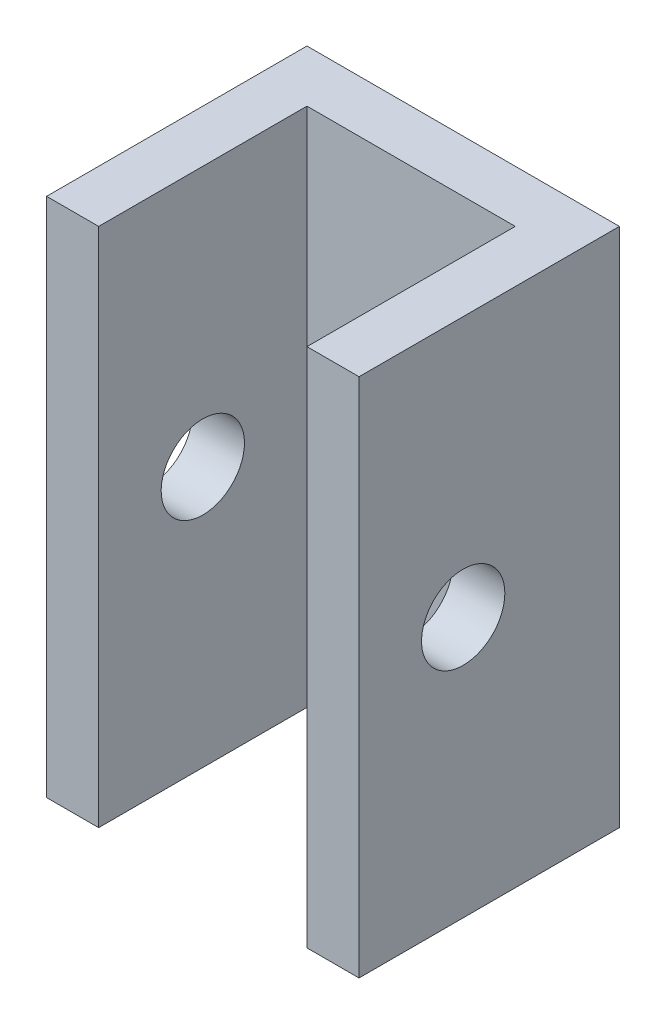
ISO-10303-21;
HEADER;
FILE_DESCRIPTION(('STEP AP214'),'2;1');
FILE_NAME('part.step','',(''),(''),'','','');
FILE_SCHEMA(('AUTOMOTIVE_DESIGN { 1 0 10303 214 1 1 1 1 }'));
ENDSEC;
DATA;
#1=APPLICATION_CONTEXT('core data for automotive mechanical design processes');
#2=APPLICATION_PROTOCOL_DEFINITION('international standard','automotive_design',2000,#1);
#3=PRODUCT_CONTEXT('',#1,'mechanical');
#4=PRODUCT('Part','Part','',(#3));
#5=PRODUCT_RELATED_PRODUCT_CATEGORY('part','',(#4));
#6=PRODUCT_DEFINITION_FORMATION('','',#4);
#7=PRODUCT_DEFINITION_CONTEXT('part definition',#1,'design');
#8=PRODUCT_DEFINITION('design','',#6,#7);
#9=PRODUCT_DEFINITION_SHAPE('','',#8);
#10=(LENGTH_UNIT() NAMED_UNIT(*) SI_UNIT(.MILLI.,.METRE.));
#11=(NAMED_UNIT(*) PLANE_ANGLE_UNIT() SI_UNIT($,.RADIAN.));
#12=(NAMED_UNIT(*) SI_UNIT($,.STERADIAN.) SOLID_ANGLE_UNIT());
#13=UNCERTAINTY_MEASURE_WITH_UNIT(LENGTH_MEASURE(1.E-05),#10,'distance_accuracy_value','');
#14=(GEOMETRIC_REPRESENTATION_CONTEXT(3) GLOBAL_UNCERTAINTY_ASSIGNED_CONTEXT((#13)) GLOBAL_UNIT_ASSIGNED_CONTEXT((#10,
#11,#12)) REPRESENTATION_CONTEXT('',''));
#15=CARTESIAN_POINT('',(0.,0.,0.));
#16=DIRECTION('',(0.,0.,1.));
#17=DIRECTION('',(1.,0.,0.));
#18=AXIS2_PLACEMENT_3D('',#15,#16,#17);
#19=CARTESIAN_POINT('',(0.,0.,5.));
#20=DIRECTION('',(0.,0.,-1.));
#21=DIRECTION('',(-1.,0.,0.));
#22=AXIS2_PLACEMENT_3D('',#19,#20,#21);
#23=PLANE('',#22);
#24=DIRECTION('',(0.,-1.,0.));
#25=VECTOR('',#24,1.);
#26=CARTESIAN_POINT('',(9.99999999999999,25.,5.));
#27=LINE('',#26,#25);
#28=CARTESIAN_POINT('',(10.,25.,5.));
#29=VERTEX_POINT('',#28);
#30=CARTESIAN_POINT('',(10.,-25.,5.));
#31=VERTEX_POINT('',#30);
#32=EDGE_CURVE('E49',#29,#31,#27,.T.);
#33=ORIENTED_EDGE('',*,*,#32,.F.);
#34=DIRECTION('',(-1.,0.,0.));
#35=VECTOR('',#34,1.);
#36=CARTESIAN_POINT('',(-15.,25.,5.));
#37=LINE('',#36,#35);
#38=CARTESIAN_POINT('',(-10.,25.,5.));
#39=VERTEX_POINT('',#38);
#40=EDGE_CURVE('E148',#29,#39,#37,.T.);
#41=ORIENTED_EDGE('',*,*,#40,.T.);
#42=DIRECTION('',(0.,1.,0.));
#43=VECTOR('',#42,1.);
#44=CARTESIAN_POINT('',(-10.,25.,5.));
#45=LINE('',#44,#43);
#46=CARTESIAN_POINT('',(-10.,-25.,5.));
#47=VERTEX_POINT('',#46);
#48=EDGE_CURVE('E129',#47,#39,#45,.T.);
#49=ORIENTED_EDGE('',*,*,#48,.F.);
#50=DIRECTION('',(1.,0.,0.));
#51=VECTOR('',#50,1.);
#52=CARTESIAN_POINT('',(-15.,-25.,5.));
#53=LINE('',#52,#51);
#54=EDGE_CURVE('E54',#47,#31,#53,.T.);
#55=ORIENTED_EDGE('',*,*,#54,.T.);
#56=EDGE_LOOP('',(#33,#41,#49,#55));
#57=FACE_BOUND('',#56,.T.);
#58=ADVANCED_FACE('F33',(#57),#23,.F.);
#59=CARTESIAN_POINT('',(15.,-25.,5.));
#60=DIRECTION('',(-1.,0.,0.));
#61=DIRECTION('',(0.,0.,1.));
#62=AXIS2_PLACEMENT_3D('',#59,#60,#61);
#63=PLANE('',#62);
#64=CARTESIAN_POINT('',(15.,-5.48172618408671E-13,15.));
#65=DIRECTION('',(1.,0.,0.));
#66=DIRECTION('',(0.,0.,-1.));
#67=AXIS2_PLACEMENT_3D('',#64,#65,#66);
#68=CIRCLE('',#67,4.);
#69=CARTESIAN_POINT('',(15.,-5.48172618408671E-13,11.));
#70=VERTEX_POINT('',#69);
#71=EDGE_CURVE('E309',#70,#70,#68,.T.);
#72=ORIENTED_EDGE('',*,*,#71,.F.);
#73=EDGE_LOOP('',(#72));
#74=FACE_BOUND('',#73,.T.);
#75=DIRECTION('',(0.,1.,0.));
#76=VECTOR('',#75,1.);
#77=CARTESIAN_POINT('',(15.,-25.,0.));
#78=LINE('',#77,#76);
#79=CARTESIAN_POINT('',(15.,-25.,0.));
#80=VERTEX_POINT('',#79);
#81=CARTESIAN_POINT('',(15.,25.,0.));
#82=VERTEX_POINT('',#81);
#83=EDGE_CURVE('E102',#80,#82,#78,.T.);
#84=ORIENTED_EDGE('',*,*,#83,.T.);
#85=DIRECTION('',(0.,0.,-1.));
#86=VECTOR('',#85,1.);
#87=CARTESIAN_POINT('',(15.,25.,5.));
#88=LINE('',#87,#86);
#89=CARTESIAN_POINT('',(15.,25.,25.));
#90=VERTEX_POINT('',#89);
#91=EDGE_CURVE('E11',#90,#82,#88,.T.);
#92=ORIENTED_EDGE('',*,*,#91,.F.);
#93=DIRECTION('',(0.,1.,0.));
#94=VECTOR('',#93,1.);
#95=CARTESIAN_POINT('',(15.,25.,25.));
#96=LINE('',#95,#94);
#97=CARTESIAN_POINT('',(15.,-25.,25.));
#98=VERTEX_POINT('',#97);
#99=EDGE_CURVE('E100',#98,#90,#96,.T.);
#100=ORIENTED_EDGE('',*,*,#99,.F.);
#101=DIRECTION('',(0.,0.,-1.));
#102=VECTOR('',#101,1.);
#103=CARTESIAN_POINT('',(15.,-25.,5.));
#104=LINE('',#103,#102);
#105=EDGE_CURVE('E152',#98,#80,#104,.T.);
#106=ORIENTED_EDGE('',*,*,#105,.T.);
#107=EDGE_LOOP('',(#84,#92,#100,#106));
#108=FACE_BOUND('',#107,.T.);
#109=ADVANCED_FACE('F35',(#74,#108),#63,.F.);
#110=CARTESIAN_POINT('',(-15.,25.,5.));
#111=DIRECTION('',(0.,-1.,0.));
#112=DIRECTION('',(0.,0.,-1.));
#113=AXIS2_PLACEMENT_3D('',#110,#111,#112);
#114=PLANE('',#113);
#115=DIRECTION('',(-1.,0.,0.));
#116=VECTOR('',#115,1.);
#117=CARTESIAN_POINT('',(-15.,25.,0.));
#118=LINE('',#117,#116);
#119=CARTESIAN_POINT('',(-15.,25.,0.));
#120=VERTEX_POINT('',#119);
#121=EDGE_CURVE('E154',#82,#120,#118,.T.);
#122=ORIENTED_EDGE('',*,*,#121,.T.);
#123=DIRECTION('',(0.,0.,-1.));
#124=VECTOR('',#123,1.);
#125=CARTESIAN_POINT('',(-15.,25.,5.));
#126=LINE('',#125,#124);
#127=CARTESIAN_POINT('',(-15.,25.,25.));
#128=VERTEX_POINT('',#127);
#129=EDGE_CURVE('E42',#128,#120,#126,.T.);
#130=ORIENTED_EDGE('',*,*,#129,.F.);
#131=DIRECTION('',(-1.,0.,0.));
#132=VECTOR('',#131,1.);
#133=CARTESIAN_POINT('',(-15.,25.,25.));
#134=LINE('',#133,#132);
#135=CARTESIAN_POINT('',(-10.,25.,25.));
#136=VERTEX_POINT('',#135);
#137=EDGE_CURVE('E137',#136,#128,#134,.T.);
#138=ORIENTED_EDGE('',*,*,#137,.F.);
#139=DIRECTION('',(0.,0.,-1.));
#140=VECTOR('',#139,1.);
#141=CARTESIAN_POINT('',(-10.,25.,25.));
#142=LINE('',#141,#140);
#143=EDGE_CURVE('E140',#136,#39,#142,.T.);
#144=ORIENTED_EDGE('',*,*,#143,.T.);
#145=ORIENTED_EDGE('',*,*,#40,.F.);
#146=DIRECTION('',(0.,0.,-1.));
#147=VECTOR('',#146,1.);
#148=CARTESIAN_POINT('',(9.99999999999999,25.,25.));
#149=LINE('',#148,#147);
#150=CARTESIAN_POINT('',(9.99999999999999,25.,25.));
#151=VERTEX_POINT('',#150);
#152=EDGE_CURVE('E108',#151,#29,#149,.T.);
#153=ORIENTED_EDGE('',*,*,#152,.F.);
#154=DIRECTION('',(-1.,0.,0.));
#155=VECTOR('',#154,1.);
#156=CARTESIAN_POINT('',(15.,25.,25.));
#157=LINE('',#156,#155);
#158=EDGE_CURVE('E105',#90,#151,#157,.T.);
#159=ORIENTED_EDGE('',*,*,#158,.F.);
#160=ORIENTED_EDGE('',*,*,#91,.T.);
#161=EDGE_LOOP('',(#122,#130,#138,#144,#145,#153,#159,#160));
#162=FACE_BOUND('',#161,.T.);
#163=ADVANCED_FACE('F106',(#162),#114,.F.);
#164=CARTESIAN_POINT('',(-15.,-25.,5.));
#165=DIRECTION('',(1.,0.,0.));
#166=DIRECTION('',(0.,0.,-1.));
#167=AXIS2_PLACEMENT_3D('',#164,#165,#166);
#168=PLANE('',#167);
#169=CARTESIAN_POINT('',(-15.,-5.48172618408671E-13,15.));
#170=DIRECTION('',(1.,0.,0.));
#171=DIRECTION('',(0.,0.,-1.));
#172=AXIS2_PLACEMENT_3D('',#169,#170,#171);
#173=CIRCLE('',#172,4.);
#174=CARTESIAN_POINT('',(-15.,-5.48172618408671E-13,11.));
#175=VERTEX_POINT('',#174);
#176=EDGE_CURVE('E305',#175,#175,#173,.T.);
#177=ORIENTED_EDGE('',*,*,#176,.T.);
#178=EDGE_LOOP('',(#177));
#179=FACE_BOUND('',#178,.T.);
#180=DIRECTION('',(0.,-1.,0.));
#181=VECTOR('',#180,1.);
#182=CARTESIAN_POINT('',(-15.,-25.,0.));
#183=LINE('',#182,#181);
#184=CARTESIAN_POINT('',(-15.,-25.,0.));
#185=VERTEX_POINT('',#184);
#186=EDGE_CURVE('E156',#120,#185,#183,.T.);
#187=ORIENTED_EDGE('',*,*,#186,.T.);
#188=DIRECTION('',(0.,0.,-1.));
#189=VECTOR('',#188,1.);
#190=CARTESIAN_POINT('',(-15.,-25.,5.));
#191=LINE('',#190,#189);
#192=CARTESIAN_POINT('',(-15.,-25.,25.));
#193=VERTEX_POINT('',#192);
#194=EDGE_CURVE('E160',#193,#185,#191,.T.);
#195=ORIENTED_EDGE('',*,*,#194,.F.);
#196=DIRECTION('',(0.,-1.,0.));
#197=VECTOR('',#196,1.);
#198=CARTESIAN_POINT('',(-15.,25.,25.));
#199=LINE('',#198,#197);
#200=EDGE_CURVE('E130',#128,#193,#199,.T.);
#201=ORIENTED_EDGE('',*,*,#200,.F.);
#202=ORIENTED_EDGE('',*,*,#129,.T.);
#203=EDGE_LOOP('',(#187,#195,#201,#202));
#204=FACE_BOUND('',#203,.T.);
#205=ADVANCED_FACE('F167',(#179,#204),#168,.F.);
#206=CARTESIAN_POINT('',(-15.,-25.,5.));
#207=DIRECTION('',(0.,1.,0.));
#208=DIRECTION('',(0.,0.,1.));
#209=AXIS2_PLACEMENT_3D('',#206,#207,#208);
#210=PLANE('',#209);
#211=DIRECTION('',(1.,0.,0.));
#212=VECTOR('',#211,1.);
#213=CARTESIAN_POINT('',(-15.,-25.,0.));
#214=LINE('',#213,#212);
#215=EDGE_CURVE('E150',#185,#80,#214,.T.);
#216=ORIENTED_EDGE('',*,*,#215,.T.);
#217=ORIENTED_EDGE('',*,*,#105,.F.);
#218=DIRECTION('',(1.,0.,0.));
#219=VECTOR('',#218,1.);
#220=CARTESIAN_POINT('',(15.,-25.,25.));
#221=LINE('',#220,#219);
#222=CARTESIAN_POINT('',(10.,-25.,25.));
#223=VERTEX_POINT('',#222);
#224=EDGE_CURVE('E116',#223,#98,#221,.T.);
#225=ORIENTED_EDGE('',*,*,#224,.F.);
#226=DIRECTION('',(0.,0.,-1.));
#227=VECTOR('',#226,1.);
#228=CARTESIAN_POINT('',(10.,-25.,25.));
#229=LINE('',#228,#227);
#230=EDGE_CURVE('E124',#223,#31,#229,.T.);
#231=ORIENTED_EDGE('',*,*,#230,.T.);
#232=ORIENTED_EDGE('',*,*,#54,.F.);
#233=DIRECTION('',(0.,0.,-1.));
#234=VECTOR('',#233,1.);
#235=CARTESIAN_POINT('',(-10.,-25.,25.));
#236=LINE('',#235,#234);
#237=CARTESIAN_POINT('',(-10.,-25.,25.));
#238=VERTEX_POINT('',#237);
#239=EDGE_CURVE('E145',#238,#47,#236,.T.);
#240=ORIENTED_EDGE('',*,*,#239,.F.);
#241=DIRECTION('',(1.,0.,0.));
#242=VECTOR('',#241,1.);
#243=CARTESIAN_POINT('',(-15.,-25.,25.));
#244=LINE('',#243,#242);
#245=EDGE_CURVE('E133',#193,#238,#244,.T.);
#246=ORIENTED_EDGE('',*,*,#245,.F.);
#247=ORIENTED_EDGE('',*,*,#194,.T.);
#248=EDGE_LOOP('',(#216,#217,#225,#231,#232,#240,#246,#247));
#249=FACE_BOUND('',#248,.T.);
#250=ADVANCED_FACE('F173',(#249),#210,.F.);
#251=CARTESIAN_POINT('',(0.,0.,0.));
#252=DIRECTION('',(0.,0.,-1.));
#253=DIRECTION('',(-1.,0.,0.));
#254=AXIS2_PLACEMENT_3D('',#251,#252,#253);
#255=PLANE('',#254);
#256=ORIENTED_EDGE('',*,*,#83,.F.);
#257=ORIENTED_EDGE('',*,*,#215,.F.);
#258=ORIENTED_EDGE('',*,*,#186,.F.);
#259=ORIENTED_EDGE('',*,*,#121,.F.);
#260=EDGE_LOOP('',(#256,#257,#258,#259));
#261=FACE_BOUND('',#260,.T.);
#262=ADVANCED_FACE('F171',(#261),#255,.T.);
#263=CARTESIAN_POINT('',(-10.,25.,25.));
#264=DIRECTION('',(-1.,0.,0.));
#265=DIRECTION('',(0.,-1.,0.));
#266=AXIS2_PLACEMENT_3D('',#263,#264,#265);
#267=PLANE('',#266);
#268=CARTESIAN_POINT('',(-10.,-5.48172618408671E-13,15.));
#269=DIRECTION('',(-1.,0.,0.));
#270=DIRECTION('',(0.,-1.,0.));
#271=AXIS2_PLACEMENT_3D('',#268,#269,#270);
#272=CIRCLE('',#271,4.);
#273=CARTESIAN_POINT('',(-10.,-4.00000000000055,15.));
#274=VERTEX_POINT('',#273);
#275=EDGE_CURVE('E118',#274,#274,#272,.T.);
#276=ORIENTED_EDGE('',*,*,#275,.T.);
#277=EDGE_LOOP('',(#276));
#278=FACE_BOUND('',#277,.T.);
#279=ORIENTED_EDGE('',*,*,#48,.T.);
#280=ORIENTED_EDGE('',*,*,#143,.F.);
#281=DIRECTION('',(0.,1.,0.));
#282=VECTOR('',#281,1.);
#283=CARTESIAN_POINT('',(-10.,25.,25.));
#284=LINE('',#283,#282);
#285=EDGE_CURVE('E135',#238,#136,#284,.T.);
#286=ORIENTED_EDGE('',*,*,#285,.F.);
#287=ORIENTED_EDGE('',*,*,#239,.T.);
#288=EDGE_LOOP('',(#279,#280,#286,#287));
#289=FACE_BOUND('',#288,.T.);
#290=ADVANCED_FACE('F181',(#278,#289),#267,.F.);
#291=CARTESIAN_POINT('',(0.,0.,25.));
#292=DIRECTION('',(0.,0.,1.));
#293=DIRECTION('',(1.,0.,0.));
#294=AXIS2_PLACEMENT_3D('',#291,#292,#293);
#295=PLANE('',#294);
#296=ORIENTED_EDGE('',*,*,#200,.T.);
#297=ORIENTED_EDGE('',*,*,#245,.T.);
#298=ORIENTED_EDGE('',*,*,#285,.T.);
#299=ORIENTED_EDGE('',*,*,#137,.T.);
#300=EDGE_LOOP('',(#296,#297,#298,#299));
#301=FACE_BOUND('',#300,.T.);
#302=ADVANCED_FACE('F178',(#301),#295,.T.);
#303=CARTESIAN_POINT('',(9.99999999999999,25.,25.));
#304=DIRECTION('',(1.,0.,0.));
#305=DIRECTION('',(0.,1.,0.));
#306=AXIS2_PLACEMENT_3D('',#303,#304,#305);
#307=PLANE('',#306);
#308=CARTESIAN_POINT('',(10.,-5.48172618408671E-13,15.));
#309=DIRECTION('',(1.,0.,0.));
#310=DIRECTION('',(0.,1.,0.));
#311=AXIS2_PLACEMENT_3D('',#308,#309,#310);
#312=CIRCLE('',#311,4.);
#313=CARTESIAN_POINT('',(10.,3.99999999999945,15.));
#314=VERTEX_POINT('',#313);
#315=EDGE_CURVE('E37',#314,#314,#312,.T.);
#316=ORIENTED_EDGE('',*,*,#315,.T.);
#317=EDGE_LOOP('',(#316));
#318=FACE_BOUND('',#317,.T.);
#319=ORIENTED_EDGE('',*,*,#32,.T.);
#320=ORIENTED_EDGE('',*,*,#230,.F.);
#321=DIRECTION('',(0.,-1.,0.));
#322=VECTOR('',#321,1.);
#323=CARTESIAN_POINT('',(9.99999999999999,25.,25.));
#324=LINE('',#323,#322);
#325=EDGE_CURVE('E111',#151,#223,#324,.T.);
#326=ORIENTED_EDGE('',*,*,#325,.F.);
#327=ORIENTED_EDGE('',*,*,#152,.T.);
#328=EDGE_LOOP('',(#319,#320,#326,#327));
#329=FACE_BOUND('',#328,.T.);
#330=ADVANCED_FACE('F184',(#318,#329),#307,.F.);
#331=CARTESIAN_POINT('',(0.,0.,25.));
#332=DIRECTION('',(0.,0.,-1.));
#333=DIRECTION('',(-1.,0.,0.));
#334=AXIS2_PLACEMENT_3D('',#331,#332,#333);
#335=PLANE('',#334);
#336=ORIENTED_EDGE('',*,*,#99,.T.);
#337=ORIENTED_EDGE('',*,*,#158,.T.);
#338=ORIENTED_EDGE('',*,*,#325,.T.);
#339=ORIENTED_EDGE('',*,*,#224,.T.);
#340=EDGE_LOOP('',(#336,#337,#338,#339));
#341=FACE_BOUND('',#340,.T.);
#342=ADVANCED_FACE('F114',(#341),#335,.F.);
#343=CARTESIAN_POINT('',(-15.,-5.48172618408671E-13,15.));
#344=DIRECTION('',(1.,0.,0.));
#345=DIRECTION('',(0.,0.,-1.));
#346=AXIS2_PLACEMENT_3D('',#343,#344,#345);
#347=CYLINDRICAL_SURFACE('',#346,4.);
#348=ORIENTED_EDGE('',*,*,#71,.T.);
#349=EDGE_LOOP('',(#348));
#350=FACE_BOUND('',#349,.T.);
#351=ORIENTED_EDGE('',*,*,#315,.F.);
#352=EDGE_LOOP('',(#351));
#353=FACE_BOUND('',#352,.T.);
#354=ADVANCED_FACE('F192',(#350,#353),#347,.F.);
#355=ORIENTED_EDGE('',*,*,#176,.F.);
#356=EDGE_LOOP('',(#355));
#357=FACE_BOUND('',#356,.T.);
#358=ORIENTED_EDGE('',*,*,#275,.F.);
#359=EDGE_LOOP('',(#358));
#360=FACE_BOUND('',#359,.T.);
#361=ADVANCED_FACE('F289',(#357,#360),#347,.F.);
#362=CLOSED_SHELL('',(#58,#109,#163,#205,#250,#262,#290,#302,#330,#342,#354,#361));
#363=MANIFOLD_SOLID_BREP('B2',#362);
#364=ADVANCED_BREP_SHAPE_REPRESENTATION('',(#18,#363),#14);
#365=SHAPE_DEFINITION_REPRESENTATION(#9,#364);
ENDSEC;
END-ISO-10303-21;
